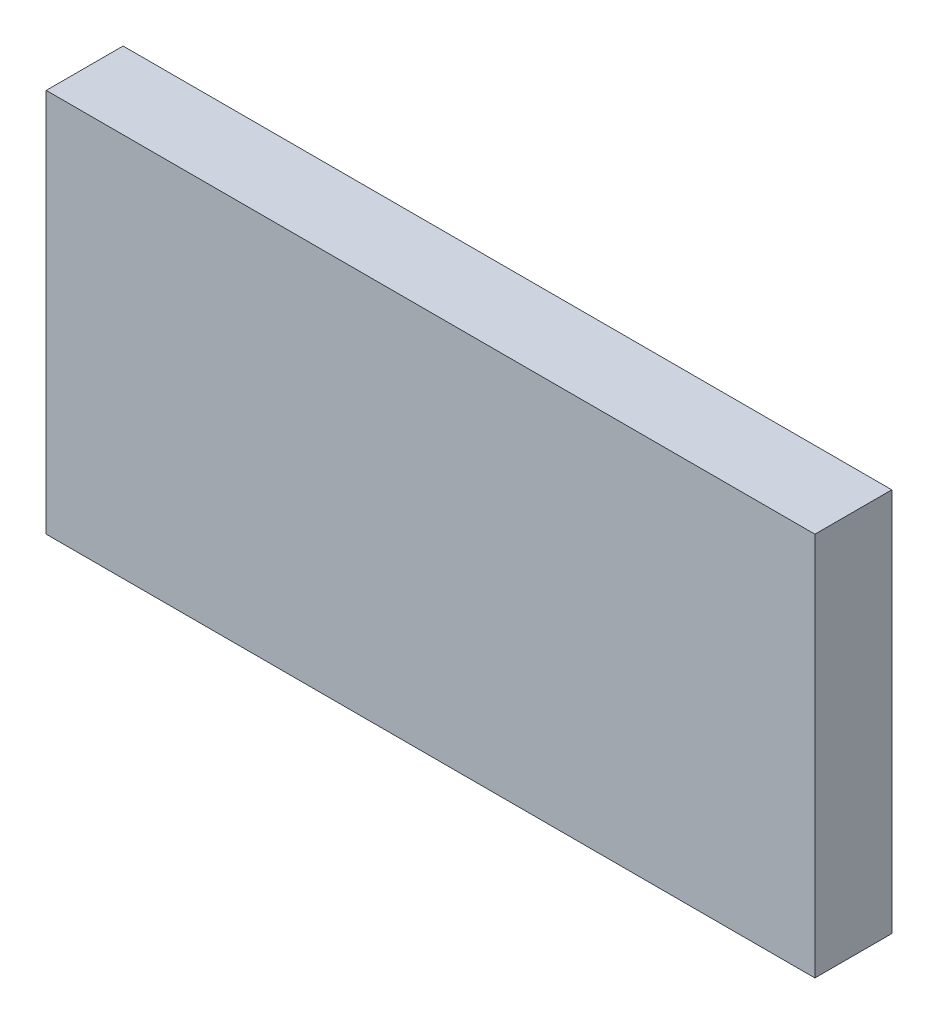
ISO-10303-21;
HEADER;
FILE_DESCRIPTION(('STEP AP214'),'2;1');
FILE_NAME('part.step','',(''),(''),'','','');
FILE_SCHEMA(('AUTOMOTIVE_DESIGN { 1 0 10303 214 1 1 1 1 }'));
ENDSEC;
DATA;
#1=APPLICATION_CONTEXT('core data for automotive mechanical design processes');
#2=APPLICATION_PROTOCOL_DEFINITION('international standard','automotive_design',2000,#1);
#3=PRODUCT_CONTEXT('',#1,'mechanical');
#4=PRODUCT('Part','Part','',(#3));
#5=PRODUCT_RELATED_PRODUCT_CATEGORY('part','',(#4));
#6=PRODUCT_DEFINITION_FORMATION('','',#4);
#7=PRODUCT_DEFINITION_CONTEXT('part definition',#1,'design');
#8=PRODUCT_DEFINITION('design','',#6,#7);
#9=PRODUCT_DEFINITION_SHAPE('','',#8);
#10=(LENGTH_UNIT() NAMED_UNIT(*) SI_UNIT(.MILLI.,.METRE.));
#11=(NAMED_UNIT(*) PLANE_ANGLE_UNIT() SI_UNIT($,.RADIAN.));
#12=(NAMED_UNIT(*) SI_UNIT($,.STERADIAN.) SOLID_ANGLE_UNIT());
#13=UNCERTAINTY_MEASURE_WITH_UNIT(LENGTH_MEASURE(1.E-05),#10,'distance_accuracy_value','');
#14=(GEOMETRIC_REPRESENTATION_CONTEXT(3) GLOBAL_UNCERTAINTY_ASSIGNED_CONTEXT((#13)) GLOBAL_UNIT_ASSIGNED_CONTEXT((#10,
#11,#12)) REPRESENTATION_CONTEXT('',''));
#15=CARTESIAN_POINT('',(0.,0.,0.));
#16=DIRECTION('',(0.,0.,1.));
#17=DIRECTION('',(1.,0.,0.));
#18=AXIS2_PLACEMENT_3D('',#15,#16,#17);
#19=CARTESIAN_POINT('',(20.,9.99999999999998,4.));
#20=DIRECTION('',(-1.,0.,0.));
#21=DIRECTION('',(0.,-1.,0.));
#22=AXIS2_PLACEMENT_3D('',#19,#20,#21);
#23=PLANE('',#22);
#24=DIRECTION('',(0.,1.,0.));
#25=VECTOR('',#24,1.);
#26=CARTESIAN_POINT('',(20.,9.99999999999998,0.));
#27=LINE('',#26,#25);
#28=CARTESIAN_POINT('',(20.0000000000001,-10.,0.));
#29=VERTEX_POINT('',#28);
#30=CARTESIAN_POINT('',(20.,9.99999999999998,0.));
#31=VERTEX_POINT('',#30);
#32=EDGE_CURVE('E107',#29,#31,#27,.T.);
#33=ORIENTED_EDGE('',*,*,#32,.T.);
#34=DIRECTION('',(0.,0.,-1.));
#35=VECTOR('',#34,1.);
#36=CARTESIAN_POINT('',(20.,9.99999999999998,4.));
#37=LINE('',#36,#35);
#38=CARTESIAN_POINT('',(20.,9.99999999999998,4.));
#39=VERTEX_POINT('',#38);
#40=EDGE_CURVE('E11',#39,#31,#37,.T.);
#41=ORIENTED_EDGE('',*,*,#40,.F.);
#42=DIRECTION('',(0.,1.,0.));
#43=VECTOR('',#42,1.);
#44=CARTESIAN_POINT('',(20.,9.99999999999998,4.));
#45=LINE('',#44,#43);
#46=CARTESIAN_POINT('',(20.0000000000001,-10.,4.));
#47=VERTEX_POINT('',#46);
#48=EDGE_CURVE('E91',#47,#39,#45,.T.);
#49=ORIENTED_EDGE('',*,*,#48,.F.);
#50=DIRECTION('',(0.,0.,-1.));
#51=VECTOR('',#50,1.);
#52=CARTESIAN_POINT('',(20.0000000000001,-10.,4.));
#53=LINE('',#52,#51);
#54=EDGE_CURVE('E103',#47,#29,#53,.T.);
#55=ORIENTED_EDGE('',*,*,#54,.T.);
#56=EDGE_LOOP('',(#33,#41,#49,#55));
#57=FACE_BOUND('',#56,.T.);
#58=ADVANCED_FACE('F39',(#57),#23,.F.);
#59=CARTESIAN_POINT('',(-20.,9.99999999999998,4.));
#60=DIRECTION('',(0.,-1.,0.));
#61=DIRECTION('',(0.,0.,-1.));
#62=AXIS2_PLACEMENT_3D('',#59,#60,#61);
#63=PLANE('',#62);
#64=DIRECTION('',(-1.,0.,0.));
#65=VECTOR('',#64,1.);
#66=CARTESIAN_POINT('',(-20.,9.99999999999998,0.));
#67=LINE('',#66,#65);
#68=CARTESIAN_POINT('',(-20.,9.99999999999998,0.));
#69=VERTEX_POINT('',#68);
#70=EDGE_CURVE('E96',#31,#69,#67,.T.);
#71=ORIENTED_EDGE('',*,*,#70,.T.);
#72=DIRECTION('',(0.,0.,-1.));
#73=VECTOR('',#72,1.);
#74=CARTESIAN_POINT('',(-20.,9.99999999999998,4.));
#75=LINE('',#74,#73);
#76=CARTESIAN_POINT('',(-20.,9.99999999999998,4.));
#77=VERTEX_POINT('',#76);
#78=EDGE_CURVE('E48',#77,#69,#75,.T.);
#79=ORIENTED_EDGE('',*,*,#78,.F.);
#80=DIRECTION('',(-1.,0.,0.));
#81=VECTOR('',#80,1.);
#82=CARTESIAN_POINT('',(-20.,9.99999999999998,4.));
#83=LINE('',#82,#81);
#84=EDGE_CURVE('E86',#39,#77,#83,.T.);
#85=ORIENTED_EDGE('',*,*,#84,.F.);
#86=ORIENTED_EDGE('',*,*,#40,.T.);
#87=EDGE_LOOP('',(#71,#79,#85,#86));
#88=FACE_BOUND('',#87,.T.);
#89=ADVANCED_FACE('F95',(#88),#63,.F.);
#90=CARTESIAN_POINT('',(-20.,9.99999999999998,4.));
#91=DIRECTION('',(1.,0.,0.));
#92=DIRECTION('',(0.,1.,0.));
#93=AXIS2_PLACEMENT_3D('',#90,#91,#92);
#94=PLANE('',#93);
#95=DIRECTION('',(0.,-1.,0.));
#96=VECTOR('',#95,1.);
#97=CARTESIAN_POINT('',(-20.,9.99999999999998,0.));
#98=LINE('',#97,#96);
#99=CARTESIAN_POINT('',(-19.9999999999999,-10.,0.));
#100=VERTEX_POINT('',#99);
#101=EDGE_CURVE('E73',#69,#100,#98,.T.);
#102=ORIENTED_EDGE('',*,*,#101,.T.);
#103=DIRECTION('',(0.,0.,-1.));
#104=VECTOR('',#103,1.);
#105=CARTESIAN_POINT('',(-19.9999999999999,-10.,4.));
#106=LINE('',#105,#104);
#107=CARTESIAN_POINT('',(-19.9999999999999,-10.,4.));
#108=VERTEX_POINT('',#107);
#109=EDGE_CURVE('E98',#108,#100,#106,.T.);
#110=ORIENTED_EDGE('',*,*,#109,.F.);
#111=DIRECTION('',(0.,-1.,0.));
#112=VECTOR('',#111,1.);
#113=CARTESIAN_POINT('',(-20.,9.99999999999998,4.));
#114=LINE('',#113,#112);
#115=EDGE_CURVE('E89',#77,#108,#114,.T.);
#116=ORIENTED_EDGE('',*,*,#115,.F.);
#117=ORIENTED_EDGE('',*,*,#78,.T.);
#118=EDGE_LOOP('',(#102,#110,#116,#117));
#119=FACE_BOUND('',#118,.T.);
#120=ADVANCED_FACE('F99',(#119),#94,.F.);
#121=CARTESIAN_POINT('',(-19.9999999999999,-10.,4.));
#122=DIRECTION('',(0.,1.,0.));
#123=DIRECTION('',(0.,0.,1.));
#124=AXIS2_PLACEMENT_3D('',#121,#122,#123);
#125=PLANE('',#124);
#126=DIRECTION('',(1.,0.,0.));
#127=VECTOR('',#126,1.);
#128=CARTESIAN_POINT('',(-19.9999999999999,-10.,0.));
#129=LINE('',#128,#127);
#130=EDGE_CURVE('E79',#100,#29,#129,.T.);
#131=ORIENTED_EDGE('',*,*,#130,.T.);
#132=ORIENTED_EDGE('',*,*,#54,.F.);
#133=DIRECTION('',(1.,0.,0.));
#134=VECTOR('',#133,1.);
#135=CARTESIAN_POINT('',(-19.9999999999999,-10.,4.));
#136=LINE('',#135,#134);
#137=EDGE_CURVE('E56',#108,#47,#136,.T.);
#138=ORIENTED_EDGE('',*,*,#137,.F.);
#139=ORIENTED_EDGE('',*,*,#109,.T.);
#140=EDGE_LOOP('',(#131,#132,#138,#139));
#141=FACE_BOUND('',#140,.T.);
#142=ADVANCED_FACE('F120',(#141),#125,.F.);
#143=CARTESIAN_POINT('',(0.,0.,4.));
#144=DIRECTION('',(0.,0.,1.));
#145=DIRECTION('',(1.,0.,0.));
#146=AXIS2_PLACEMENT_3D('',#143,#144,#145);
#147=PLANE('',#146);
#148=ORIENTED_EDGE('',*,*,#48,.T.);
#149=ORIENTED_EDGE('',*,*,#84,.T.);
#150=ORIENTED_EDGE('',*,*,#115,.T.);
#151=ORIENTED_EDGE('',*,*,#137,.T.);
#152=EDGE_LOOP('',(#148,#149,#150,#151));
#153=FACE_BOUND('',#152,.T.);
#154=ADVANCED_FACE('F87',(#153),#147,.T.);
#155=CARTESIAN_POINT('',(0.,0.,0.));
#156=DIRECTION('',(0.,0.,1.));
#157=DIRECTION('',(1.,0.,0.));
#158=AXIS2_PLACEMENT_3D('',#155,#156,#157);
#159=PLANE('',#158);
#160=ORIENTED_EDGE('',*,*,#32,.F.);
#161=ORIENTED_EDGE('',*,*,#130,.F.);
#162=ORIENTED_EDGE('',*,*,#101,.F.);
#163=ORIENTED_EDGE('',*,*,#70,.F.);
#164=EDGE_LOOP('',(#160,#161,#162,#163));
#165=FACE_BOUND('',#164,.T.);
#166=ADVANCED_FACE('F123',(#165),#159,.F.);
#167=CLOSED_SHELL('',(#58,#89,#120,#142,#154,#166));
#168=MANIFOLD_SOLID_BREP('B2',#167);
#169=ADVANCED_BREP_SHAPE_REPRESENTATION('',(#18,#168),#14);
#170=SHAPE_DEFINITION_REPRESENTATION(#9,#169);
ENDSEC;
END-ISO-10303-21;
